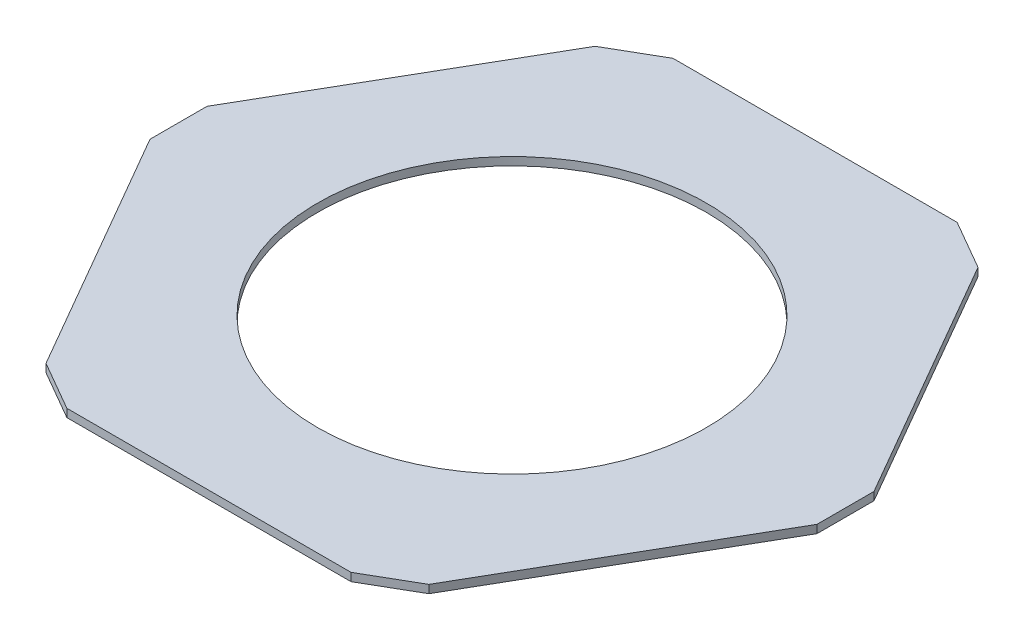
ISO-10303-21;
HEADER;
FILE_DESCRIPTION(('STEP AP214'),'2;1');
FILE_NAME('part.step','',(''),(''),'','','');
FILE_SCHEMA(('AUTOMOTIVE_DESIGN { 1 0 10303 214 1 1 1 1 }'));
ENDSEC;
DATA;
#1=APPLICATION_CONTEXT('core data for automotive mechanical design processes');
#2=APPLICATION_PROTOCOL_DEFINITION('international standard','automotive_design',2000,#1);
#3=PRODUCT_CONTEXT('',#1,'mechanical');
#4=PRODUCT('Part','Part','',(#3));
#5=PRODUCT_RELATED_PRODUCT_CATEGORY('part','',(#4));
#6=PRODUCT_DEFINITION_FORMATION('','',#4);
#7=PRODUCT_DEFINITION_CONTEXT('part definition',#1,'design');
#8=PRODUCT_DEFINITION('design','',#6,#7);
#9=PRODUCT_DEFINITION_SHAPE('','',#8);
#10=(LENGTH_UNIT() NAMED_UNIT(*) SI_UNIT(.MILLI.,.METRE.));
#11=(NAMED_UNIT(*) PLANE_ANGLE_UNIT() SI_UNIT($,.RADIAN.));
#12=(NAMED_UNIT(*) SI_UNIT($,.STERADIAN.) SOLID_ANGLE_UNIT());
#13=UNCERTAINTY_MEASURE_WITH_UNIT(LENGTH_MEASURE(1.E-05),#10,'distance_accuracy_value','');
#14=(GEOMETRIC_REPRESENTATION_CONTEXT(3) GLOBAL_UNCERTAINTY_ASSIGNED_CONTEXT((#13)) GLOBAL_UNIT_ASSIGNED_CONTEXT((#10,
#11,#12)) REPRESENTATION_CONTEXT('',''));
#15=CARTESIAN_POINT('',(0.,0.,0.));
#16=DIRECTION('',(0.,0.,1.));
#17=DIRECTION('',(1.,0.,0.));
#18=AXIS2_PLACEMENT_3D('',#15,#16,#17);
#19=CARTESIAN_POINT('',(438.317943801325,25.,-934.97088083213));
#20=DIRECTION('',(0.,0.,1.));
#21=DIRECTION('',(1.,0.,0.));
#22=AXIS2_PLACEMENT_3D('',#19,#20,#21);
#23=PLANE('',#22);
#24=DIRECTION('',(-1.,0.,0.));
#25=VECTOR('',#24,1.);
#26=CARTESIAN_POINT('',(438.317943801325,0.,-934.97088083213));
#27=LINE('',#26,#25);
#28=CARTESIAN_POINT('',(438.317943801325,0.,-934.97088083213));
#29=VERTEX_POINT('',#28);
#30=CARTESIAN_POINT('',(-438.317943801361,0.,-934.97088083213));
#31=VERTEX_POINT('',#30);
#32=EDGE_CURVE('E157',#29,#31,#27,.T.);
#33=ORIENTED_EDGE('',*,*,#32,.T.);
#34=DIRECTION('',(0.,-1.,0.));
#35=VECTOR('',#34,1.);
#36=CARTESIAN_POINT('',(-438.317943801361,25.,-934.97088083213));
#37=LINE('',#36,#35);
#38=CARTESIAN_POINT('',(-438.317943801361,25.,-934.97088083213));
#39=VERTEX_POINT('',#38);
#40=EDGE_CURVE('E11',#39,#31,#37,.T.);
#41=ORIENTED_EDGE('',*,*,#40,.F.);
#42=DIRECTION('',(-1.,0.,0.));
#43=VECTOR('',#42,1.);
#44=CARTESIAN_POINT('',(438.317943801325,25.,-934.97088083213));
#45=LINE('',#44,#43);
#46=CARTESIAN_POINT('',(438.317943801325,25.,-934.97088083213));
#47=VERTEX_POINT('',#46);
#48=EDGE_CURVE('E180',#47,#39,#45,.T.);
#49=ORIENTED_EDGE('',*,*,#48,.F.);
#50=DIRECTION('',(0.,-1.,0.));
#51=VECTOR('',#50,1.);
#52=CARTESIAN_POINT('',(438.317943801325,25.,-934.97088083213));
#53=LINE('',#52,#51);
#54=EDGE_CURVE('E153',#47,#29,#53,.T.);
#55=ORIENTED_EDGE('',*,*,#54,.T.);
#56=EDGE_LOOP('',(#33,#41,#49,#55));
#57=FACE_BOUND('',#56,.T.);
#58=ADVANCED_FACE('F37',(#57),#23,.F.);
#59=CARTESIAN_POINT('',(-590.549562698659,25.,-847.079914682582));
#60=DIRECTION('',(0.500000000000088,0.,0.866025403784388));
#61=DIRECTION('',(0.866025403784388,0.,-0.500000000000088));
#62=AXIS2_PLACEMENT_3D('',#59,#60,#61);
#63=PLANE('',#62);
#64=DIRECTION('',(-0.866025403784388,0.,0.500000000000088));
#65=VECTOR('',#64,1.);
#66=CARTESIAN_POINT('',(-590.549562698659,0.,-847.079914682582));
#67=LINE('',#66,#65);
#68=CARTESIAN_POINT('',(-590.549562698659,0.,-847.079914682582));
#69=VERTEX_POINT('',#68);
#70=EDGE_CURVE('E160',#31,#69,#67,.T.);
#71=ORIENTED_EDGE('',*,*,#70,.T.);
#72=DIRECTION('',(0.,-1.,0.));
#73=VECTOR('',#72,1.);
#74=CARTESIAN_POINT('',(-590.549562698659,25.,-847.079914682582));
#75=LINE('',#74,#73);
#76=CARTESIAN_POINT('',(-590.549562698659,25.,-847.079914682582));
#77=VERTEX_POINT('',#76);
#78=EDGE_CURVE('E45',#77,#69,#75,.T.);
#79=ORIENTED_EDGE('',*,*,#78,.F.);
#80=DIRECTION('',(-0.866025403784388,0.,0.500000000000088));
#81=VECTOR('',#80,1.);
#82=CARTESIAN_POINT('',(-590.549562698659,25.,-847.079914682582));
#83=LINE('',#82,#81);
#84=EDGE_CURVE('E108',#39,#77,#83,.T.);
#85=ORIENTED_EDGE('',*,*,#84,.F.);
#86=ORIENTED_EDGE('',*,*,#40,.T.);
#87=EDGE_LOOP('',(#71,#79,#85,#86));
#88=FACE_BOUND('',#87,.T.);
#89=ADVANCED_FACE('F259',(#88),#63,.F.);
#90=CARTESIAN_POINT('',(-590.549562698659,25.,-847.079914682582));
#91=DIRECTION('',(0.866025403784439,0.,0.499999999999999));
#92=DIRECTION('',(0.499999999999999,0.,-0.866025403784439));
#93=AXIS2_PLACEMENT_3D('',#90,#91,#92);
#94=PLANE('',#93);
#95=DIRECTION('',(-0.499999999999999,0.,0.866025403784439));
#96=VECTOR('',#95,1.);
#97=CARTESIAN_POINT('',(-590.549562698659,0.,-847.079914682582));
#98=LINE('',#97,#96);
#99=CARTESIAN_POINT('',(-1028.8675065,0.,-87.8909661495356));
#100=VERTEX_POINT('',#99);
#101=EDGE_CURVE('E163',#69,#100,#98,.T.);
#102=ORIENTED_EDGE('',*,*,#101,.T.);
#103=DIRECTION('',(0.,-1.,0.));
#104=VECTOR('',#103,1.);
#105=CARTESIAN_POINT('',(-1028.8675065,25.,-87.8909661495356));
#106=LINE('',#105,#104);
#107=CARTESIAN_POINT('',(-1028.8675065,25.,-87.8909661495356));
#108=VERTEX_POINT('',#107);
#109=EDGE_CURVE('E199',#108,#100,#106,.T.);
#110=ORIENTED_EDGE('',*,*,#109,.F.);
#111=DIRECTION('',(-0.499999999999999,0.,0.866025403784439));
#112=VECTOR('',#111,1.);
#113=CARTESIAN_POINT('',(-590.549562698659,25.,-847.079914682582));
#114=LINE('',#113,#112);
#115=EDGE_CURVE('E207',#77,#108,#114,.T.);
#116=ORIENTED_EDGE('',*,*,#115,.F.);
#117=ORIENTED_EDGE('',*,*,#78,.T.);
#118=EDGE_LOOP('',(#102,#110,#116,#117));
#119=FACE_BOUND('',#118,.T.);
#120=ADVANCED_FACE('F205',(#119),#94,.F.);
#121=CARTESIAN_POINT('',(-1028.8675065,25.,87.8909661495384));
#122=DIRECTION('',(1.,0.,0.));
#123=DIRECTION('',(0.,0.,-1.));
#124=AXIS2_PLACEMENT_3D('',#121,#122,#123);
#125=PLANE('',#124);
#126=DIRECTION('',(0.,0.,1.));
#127=VECTOR('',#126,1.);
#128=CARTESIAN_POINT('',(-1028.8675065,0.,87.8909661495384));
#129=LINE('',#128,#127);
#130=CARTESIAN_POINT('',(-1028.8675065,0.,87.8909661495384));
#131=VERTEX_POINT('',#130);
#132=EDGE_CURVE('E165',#100,#131,#129,.T.);
#133=ORIENTED_EDGE('',*,*,#132,.T.);
#134=DIRECTION('',(0.,-1.,0.));
#135=VECTOR('',#134,1.);
#136=CARTESIAN_POINT('',(-1028.8675065,25.,87.8909661495384));
#137=LINE('',#136,#135);
#138=CARTESIAN_POINT('',(-1028.8675065,25.,87.8909661495384));
#139=VERTEX_POINT('',#138);
#140=EDGE_CURVE('E196',#139,#131,#137,.T.);
#141=ORIENTED_EDGE('',*,*,#140,.F.);
#142=DIRECTION('',(0.,0.,1.));
#143=VECTOR('',#142,1.);
#144=CARTESIAN_POINT('',(-1028.8675065,25.,87.8909661495384));
#145=LINE('',#144,#143);
#146=EDGE_CURVE('E225',#108,#139,#145,.T.);
#147=ORIENTED_EDGE('',*,*,#146,.F.);
#148=ORIENTED_EDGE('',*,*,#109,.T.);
#149=EDGE_LOOP('',(#133,#141,#147,#148));
#150=FACE_BOUND('',#149,.T.);
#151=ADVANCED_FACE('F216',(#150),#125,.F.);
#152=CARTESIAN_POINT('',(-1028.8675065,25.,87.8909661495384));
#153=DIRECTION('',(0.866025403784441,0.,-0.499999999999996));
#154=DIRECTION('',(-0.499999999999996,0.,-0.866025403784441));
#155=AXIS2_PLACEMENT_3D('',#152,#153,#154);
#156=PLANE('',#155);
#157=DIRECTION('',(0.499999999999996,0.,0.866025403784441));
#158=VECTOR('',#157,1.);
#159=CARTESIAN_POINT('',(-1028.8675065,0.,87.8909661495384));
#160=LINE('',#159,#158);
#161=CARTESIAN_POINT('',(-590.549562698664,0.,847.07991468258));
#162=VERTEX_POINT('',#161);
#163=EDGE_CURVE('E167',#131,#162,#160,.T.);
#164=ORIENTED_EDGE('',*,*,#163,.T.);
#165=DIRECTION('',(0.,-1.,0.));
#166=VECTOR('',#165,1.);
#167=CARTESIAN_POINT('',(-590.549562698664,25.,847.07991468258));
#168=LINE('',#167,#166);
#169=CARTESIAN_POINT('',(-590.549562698664,25.,847.07991468258));
#170=VERTEX_POINT('',#169);
#171=EDGE_CURVE('E193',#170,#162,#168,.T.);
#172=ORIENTED_EDGE('',*,*,#171,.F.);
#173=DIRECTION('',(0.499999999999996,0.,0.866025403784441));
#174=VECTOR('',#173,1.);
#175=CARTESIAN_POINT('',(-1028.8675065,25.,87.8909661495384));
#176=LINE('',#175,#174);
#177=EDGE_CURVE('E222',#139,#170,#176,.T.);
#178=ORIENTED_EDGE('',*,*,#177,.F.);
#179=ORIENTED_EDGE('',*,*,#140,.T.);
#180=EDGE_LOOP('',(#164,#172,#178,#179));
#181=FACE_BOUND('',#180,.T.);
#182=ADVANCED_FACE('F220',(#181),#156,.F.);
#183=CARTESIAN_POINT('',(-438.317943801357,25.,934.970880832112));
#184=DIRECTION('',(0.499999999999996,0.,-0.866025403784441));
#185=DIRECTION('',(-0.866025403784441,0.,-0.499999999999996));
#186=AXIS2_PLACEMENT_3D('',#183,#184,#185);
#187=PLANE('',#186);
#188=DIRECTION('',(0.866025403784441,0.,0.499999999999996));
#189=VECTOR('',#188,1.);
#190=CARTESIAN_POINT('',(-438.317943801357,0.,934.970880832112));
#191=LINE('',#190,#189);
#192=CARTESIAN_POINT('',(-438.317943801357,0.,934.970880832112));
#193=VERTEX_POINT('',#192);
#194=EDGE_CURVE('E169',#162,#193,#191,.T.);
#195=ORIENTED_EDGE('',*,*,#194,.T.);
#196=DIRECTION('',(0.,-1.,0.));
#197=VECTOR('',#196,1.);
#198=CARTESIAN_POINT('',(-438.317943801357,25.,934.970880832112));
#199=LINE('',#198,#197);
#200=CARTESIAN_POINT('',(-438.317943801357,25.,934.970880832112));
#201=VERTEX_POINT('',#200);
#202=EDGE_CURVE('E190',#201,#193,#199,.T.);
#203=ORIENTED_EDGE('',*,*,#202,.F.);
#204=DIRECTION('',(0.866025403784441,0.,0.499999999999996));
#205=VECTOR('',#204,1.);
#206=CARTESIAN_POINT('',(-438.317943801357,25.,934.970880832112));
#207=LINE('',#206,#205);
#208=EDGE_CURVE('E224',#170,#201,#207,.T.);
#209=ORIENTED_EDGE('',*,*,#208,.F.);
#210=ORIENTED_EDGE('',*,*,#171,.T.);
#211=EDGE_LOOP('',(#195,#203,#209,#210));
#212=FACE_BOUND('',#211,.T.);
#213=ADVANCED_FACE('F272',(#212),#187,.F.);
#214=CARTESIAN_POINT('',(-438.317943801357,25.,934.970880832112));
#215=DIRECTION('',(0.,0.,-1.));
#216=DIRECTION('',(-1.,0.,0.));
#217=AXIS2_PLACEMENT_3D('',#214,#215,#216);
#218=PLANE('',#217);
#219=DIRECTION('',(1.,0.,0.));
#220=VECTOR('',#219,1.);
#221=CARTESIAN_POINT('',(-438.317943801357,0.,934.970880832112));
#222=LINE('',#221,#220);
#223=CARTESIAN_POINT('',(438.317943801329,0.,934.970880832112));
#224=VERTEX_POINT('',#223);
#225=EDGE_CURVE('E171',#193,#224,#222,.T.);
#226=ORIENTED_EDGE('',*,*,#225,.T.);
#227=DIRECTION('',(0.,-1.,0.));
#228=VECTOR('',#227,1.);
#229=CARTESIAN_POINT('',(438.317943801329,25.,934.970880832112));
#230=LINE('',#229,#228);
#231=CARTESIAN_POINT('',(438.317943801329,25.,934.970880832112));
#232=VERTEX_POINT('',#231);
#233=EDGE_CURVE('E187',#232,#224,#230,.T.);
#234=ORIENTED_EDGE('',*,*,#233,.F.);
#235=DIRECTION('',(1.,0.,0.));
#236=VECTOR('',#235,1.);
#237=CARTESIAN_POINT('',(-438.317943801357,25.,934.970880832112));
#238=LINE('',#237,#236);
#239=EDGE_CURVE('E227',#201,#232,#238,.T.);
#240=ORIENTED_EDGE('',*,*,#239,.F.);
#241=ORIENTED_EDGE('',*,*,#202,.T.);
#242=EDGE_LOOP('',(#226,#234,#240,#241));
#243=FACE_BOUND('',#242,.T.);
#244=ADVANCED_FACE('F275',(#243),#218,.F.);
#245=CARTESIAN_POINT('',(590.549562698635,25.,847.079914682577));
#246=DIRECTION('',(-0.500000000000013,0.,-0.866025403784431));
#247=DIRECTION('',(-0.866025403784431,0.,0.500000000000013));
#248=AXIS2_PLACEMENT_3D('',#245,#246,#247);
#249=PLANE('',#248);
#250=DIRECTION('',(0.866025403784431,0.,-0.500000000000013));
#251=VECTOR('',#250,1.);
#252=CARTESIAN_POINT('',(590.549562698635,0.,847.079914682577));
#253=LINE('',#252,#251);
#254=CARTESIAN_POINT('',(590.549562698635,0.,847.079914682577));
#255=VERTEX_POINT('',#254);
#256=EDGE_CURVE('E173',#224,#255,#253,.T.);
#257=ORIENTED_EDGE('',*,*,#256,.T.);
#258=DIRECTION('',(0.,-1.,0.));
#259=VECTOR('',#258,1.);
#260=CARTESIAN_POINT('',(590.549562698635,25.,847.079914682577));
#261=LINE('',#260,#259);
#262=CARTESIAN_POINT('',(590.549562698635,25.,847.079914682577));
#263=VERTEX_POINT('',#262);
#264=EDGE_CURVE('E184',#263,#255,#261,.T.);
#265=ORIENTED_EDGE('',*,*,#264,.F.);
#266=DIRECTION('',(0.866025403784431,0.,-0.500000000000013));
#267=VECTOR('',#266,1.);
#268=CARTESIAN_POINT('',(590.549562698635,25.,847.079914682577));
#269=LINE('',#268,#267);
#270=EDGE_CURVE('E233',#232,#263,#269,.T.);
#271=ORIENTED_EDGE('',*,*,#270,.F.);
#272=ORIENTED_EDGE('',*,*,#233,.T.);
#273=EDGE_LOOP('',(#257,#265,#271,#272));
#274=FACE_BOUND('',#273,.T.);
#275=ADVANCED_FACE('F239',(#274),#249,.F.);
#276=CARTESIAN_POINT('',(590.549562698635,25.,847.079914682577));
#277=DIRECTION('',(-0.866025403784444,0.,-0.499999999999991));
#278=DIRECTION('',(-0.499999999999991,0.,0.866025403784444));
#279=AXIS2_PLACEMENT_3D('',#276,#277,#278);
#280=PLANE('',#279);
#281=DIRECTION('',(0.499999999999991,0.,-0.866025403784444));
#282=VECTOR('',#281,1.);
#283=CARTESIAN_POINT('',(590.549562698635,0.,847.079914682577));
#284=LINE('',#283,#282);
#285=CARTESIAN_POINT('',(1028.86750649997,0.,87.8909661495261));
#286=VERTEX_POINT('',#285);
#287=EDGE_CURVE('E175',#255,#286,#284,.T.);
#288=ORIENTED_EDGE('',*,*,#287,.T.);
#289=DIRECTION('',(0.,-1.,0.));
#290=VECTOR('',#289,1.);
#291=CARTESIAN_POINT('',(1028.86750649997,25.,87.8909661495261));
#292=LINE('',#291,#290);
#293=CARTESIAN_POINT('',(1028.86750649997,25.,87.8909661495261));
#294=VERTEX_POINT('',#293);
#295=EDGE_CURVE('E148',#294,#286,#292,.T.);
#296=ORIENTED_EDGE('',*,*,#295,.F.);
#297=DIRECTION('',(0.499999999999991,0.,-0.866025403784444));
#298=VECTOR('',#297,1.);
#299=CARTESIAN_POINT('',(590.549562698635,25.,847.079914682577));
#300=LINE('',#299,#298);
#301=EDGE_CURVE('E139',#263,#294,#300,.T.);
#302=ORIENTED_EDGE('',*,*,#301,.F.);
#303=ORIENTED_EDGE('',*,*,#264,.T.);
#304=EDGE_LOOP('',(#288,#296,#302,#303));
#305=FACE_BOUND('',#304,.T.);
#306=ADVANCED_FACE('F243',(#305),#280,.F.);
#307=CARTESIAN_POINT('',(1028.86750649995,25.,-87.8909661495389));
#308=DIRECTION('',(-1.,0.,1.01054574617946E-13));
#309=DIRECTION('',(1.01054574617946E-13,0.,1.));
#310=AXIS2_PLACEMENT_3D('',#307,#308,#309);
#311=PLANE('',#310);
#312=DIRECTION('',(-1.01054574617945E-13,0.,-1.));
#313=VECTOR('',#312,1.);
#314=CARTESIAN_POINT('',(1028.86750649995,0.,-87.8909661495389));
#315=LINE('',#314,#313);
#316=CARTESIAN_POINT('',(1028.86750649995,0.,-87.8909661495389));
#317=VERTEX_POINT('',#316);
#318=EDGE_CURVE('E147',#286,#317,#315,.T.);
#319=ORIENTED_EDGE('',*,*,#318,.T.);
#320=DIRECTION('',(0.,-1.,0.));
#321=VECTOR('',#320,1.);
#322=CARTESIAN_POINT('',(1028.86750649995,25.,-87.8909661495389));
#323=LINE('',#322,#321);
#324=CARTESIAN_POINT('',(1028.86750649995,25.,-87.8909661495389));
#325=VERTEX_POINT('',#324);
#326=EDGE_CURVE('E144',#325,#317,#323,.T.);
#327=ORIENTED_EDGE('',*,*,#326,.F.);
#328=DIRECTION('',(-1.01054574617945E-13,0.,-1.));
#329=VECTOR('',#328,1.);
#330=CARTESIAN_POINT('',(1028.86750649995,25.,-87.8909661495389));
#331=LINE('',#330,#329);
#332=EDGE_CURVE('E133',#294,#325,#331,.T.);
#333=ORIENTED_EDGE('',*,*,#332,.F.);
#334=ORIENTED_EDGE('',*,*,#295,.T.);
#335=EDGE_LOOP('',(#319,#327,#333,#334));
#336=FACE_BOUND('',#335,.T.);
#337=ADVANCED_FACE('F145',(#336),#311,.F.);
#338=CARTESIAN_POINT('',(1028.86750649995,25.,-87.8909661495389));
#339=DIRECTION('',(-0.866025403784454,0.,0.499999999999974));
#340=DIRECTION('',(0.499999999999974,0.,0.866025403784454));
#341=AXIS2_PLACEMENT_3D('',#338,#339,#340);
#342=PLANE('',#341);
#343=DIRECTION('',(-0.499999999999974,0.,-0.866025403784454));
#344=VECTOR('',#343,1.);
#345=CARTESIAN_POINT('',(1028.86750649995,0.,-87.8909661495389));
#346=LINE('',#345,#344);
#347=CARTESIAN_POINT('',(590.549562698632,0.,-847.079914682598));
#348=VERTEX_POINT('',#347);
#349=EDGE_CURVE('E94',#317,#348,#346,.T.);
#350=ORIENTED_EDGE('',*,*,#349,.T.);
#351=DIRECTION('',(0.,-1.,0.));
#352=VECTOR('',#351,1.);
#353=CARTESIAN_POINT('',(590.549562698632,25.,-847.079914682598));
#354=LINE('',#353,#352);
#355=CARTESIAN_POINT('',(590.549562698632,25.,-847.079914682598));
#356=VERTEX_POINT('',#355);
#357=EDGE_CURVE('E149',#356,#348,#354,.T.);
#358=ORIENTED_EDGE('',*,*,#357,.F.);
#359=DIRECTION('',(-0.499999999999974,0.,-0.866025403784454));
#360=VECTOR('',#359,1.);
#361=CARTESIAN_POINT('',(1028.86750649995,25.,-87.8909661495389));
#362=LINE('',#361,#360);
#363=EDGE_CURVE('E137',#325,#356,#362,.T.);
#364=ORIENTED_EDGE('',*,*,#363,.F.);
#365=ORIENTED_EDGE('',*,*,#326,.T.);
#366=EDGE_LOOP('',(#350,#358,#364,#365));
#367=FACE_BOUND('',#366,.T.);
#368=ADVANCED_FACE('F151',(#367),#342,.F.);
#369=CARTESIAN_POINT('',(438.317943801325,25.,-934.97088083213));
#370=DIRECTION('',(-0.499999999999997,0.,0.86602540378444));
#371=DIRECTION('',(0.86602540378444,0.,0.499999999999997));
#372=AXIS2_PLACEMENT_3D('',#369,#370,#371);
#373=PLANE('',#372);
#374=DIRECTION('',(-0.86602540378444,0.,-0.499999999999997));
#375=VECTOR('',#374,1.);
#376=CARTESIAN_POINT('',(438.317943801325,0.,-934.97088083213));
#377=LINE('',#376,#375);
#378=EDGE_CURVE('E100',#348,#29,#377,.T.);
#379=ORIENTED_EDGE('',*,*,#378,.T.);
#380=ORIENTED_EDGE('',*,*,#54,.F.);
#381=DIRECTION('',(-0.86602540378444,0.,-0.499999999999997));
#382=VECTOR('',#381,1.);
#383=CARTESIAN_POINT('',(438.317943801325,25.,-934.97088083213));
#384=LINE('',#383,#382);
#385=EDGE_CURVE('E53',#356,#47,#384,.T.);
#386=ORIENTED_EDGE('',*,*,#385,.F.);
#387=ORIENTED_EDGE('',*,*,#357,.T.);
#388=EDGE_LOOP('',(#379,#380,#386,#387));
#389=FACE_BOUND('',#388,.T.);
#390=ADVANCED_FACE('F247',(#389),#373,.F.);
#391=CARTESIAN_POINT('',(0.,25.,0.));
#392=DIRECTION('',(0.,-1.,0.));
#393=DIRECTION('',(0.,0.,-1.));
#394=AXIS2_PLACEMENT_3D('',#391,#392,#393);
#395=PLANE('',#394);
#396=CARTESIAN_POINT('',(0.,25.,0.));
#397=DIRECTION('',(0.,1.,0.));
#398=DIRECTION('',(0.,0.,1.));
#399=AXIS2_PLACEMENT_3D('',#396,#397,#398);
#400=CIRCLE('',#399,600.);
#401=CARTESIAN_POINT('',(0.,25.,600.));
#402=VERTEX_POINT('',#401);
#403=EDGE_CURVE('E161',#402,#402,#400,.T.);
#404=ORIENTED_EDGE('',*,*,#403,.F.);
#405=EDGE_LOOP('',(#404));
#406=FACE_BOUND('',#405,.T.);
#407=ORIENTED_EDGE('',*,*,#48,.T.);
#408=ORIENTED_EDGE('',*,*,#84,.T.);
#409=ORIENTED_EDGE('',*,*,#115,.T.);
#410=ORIENTED_EDGE('',*,*,#146,.T.);
#411=ORIENTED_EDGE('',*,*,#177,.T.);
#412=ORIENTED_EDGE('',*,*,#208,.T.);
#413=ORIENTED_EDGE('',*,*,#239,.T.);
#414=ORIENTED_EDGE('',*,*,#270,.T.);
#415=ORIENTED_EDGE('',*,*,#301,.T.);
#416=ORIENTED_EDGE('',*,*,#332,.T.);
#417=ORIENTED_EDGE('',*,*,#363,.T.);
#418=ORIENTED_EDGE('',*,*,#385,.T.);
#419=EDGE_LOOP('',(#407,#408,#409,#410,#411,#412,#413,#414,#415,#416,#417,#418));
#420=FACE_BOUND('',#419,.T.);
#421=ADVANCED_FACE('F135',(#406,#420),#395,.F.);
#422=CARTESIAN_POINT('',(0.,0.,0.));
#423=DIRECTION('',(0.,-1.,0.));
#424=DIRECTION('',(0.,0.,-1.));
#425=AXIS2_PLACEMENT_3D('',#422,#423,#424);
#426=PLANE('',#425);
#427=CARTESIAN_POINT('',(0.,0.,0.));
#428=DIRECTION('',(0.,-1.,0.));
#429=DIRECTION('',(0.,0.,-1.));
#430=AXIS2_PLACEMENT_3D('',#427,#428,#429);
#431=CIRCLE('',#430,600.);
#432=CARTESIAN_POINT('',(0.,0.,-600.));
#433=VERTEX_POINT('',#432);
#434=EDGE_CURVE('E328',#433,#433,#431,.F.);
#435=ORIENTED_EDGE('',*,*,#434,.T.);
#436=EDGE_LOOP('',(#435));
#437=FACE_BOUND('',#436,.T.);
#438=ORIENTED_EDGE('',*,*,#32,.F.);
#439=ORIENTED_EDGE('',*,*,#378,.F.);
#440=ORIENTED_EDGE('',*,*,#349,.F.);
#441=ORIENTED_EDGE('',*,*,#318,.F.);
#442=ORIENTED_EDGE('',*,*,#287,.F.);
#443=ORIENTED_EDGE('',*,*,#256,.F.);
#444=ORIENTED_EDGE('',*,*,#225,.F.);
#445=ORIENTED_EDGE('',*,*,#194,.F.);
#446=ORIENTED_EDGE('',*,*,#163,.F.);
#447=ORIENTED_EDGE('',*,*,#132,.F.);
#448=ORIENTED_EDGE('',*,*,#101,.F.);
#449=ORIENTED_EDGE('',*,*,#70,.F.);
#450=EDGE_LOOP('',(#438,#439,#440,#441,#442,#443,#444,#445,#446,#447,#448,#449));
#451=FACE_BOUND('',#450,.T.);
#452=ADVANCED_FACE('F211',(#437,#451),#426,.T.);
#453=CARTESIAN_POINT('',(0.,-0.001000000000001,0.));
#454=DIRECTION('',(0.,1.,0.));
#455=DIRECTION('',(0.,0.,1.));
#456=AXIS2_PLACEMENT_3D('',#453,#454,#455);
#457=CYLINDRICAL_SURFACE('',#456,600.);
#458=ORIENTED_EDGE('',*,*,#434,.F.);
#459=EDGE_LOOP('',(#458));
#460=FACE_BOUND('',#459,.T.);
#461=ORIENTED_EDGE('',*,*,#403,.T.);
#462=EDGE_LOOP('',(#461));
#463=FACE_BOUND('',#462,.T.);
#464=ADVANCED_FACE('F312',(#460,#463),#457,.F.);
#465=CLOSED_SHELL('',(#58,#89,#120,#151,#182,#213,#244,#275,#306,#337,#368,#390,#421,#452,#464));
#466=MANIFOLD_SOLID_BREP('B2',#465);
#467=ADVANCED_BREP_SHAPE_REPRESENTATION('',(#18,#466),#14);
#468=SHAPE_DEFINITION_REPRESENTATION(#9,#467);
ENDSEC;
END-ISO-10303-21;
